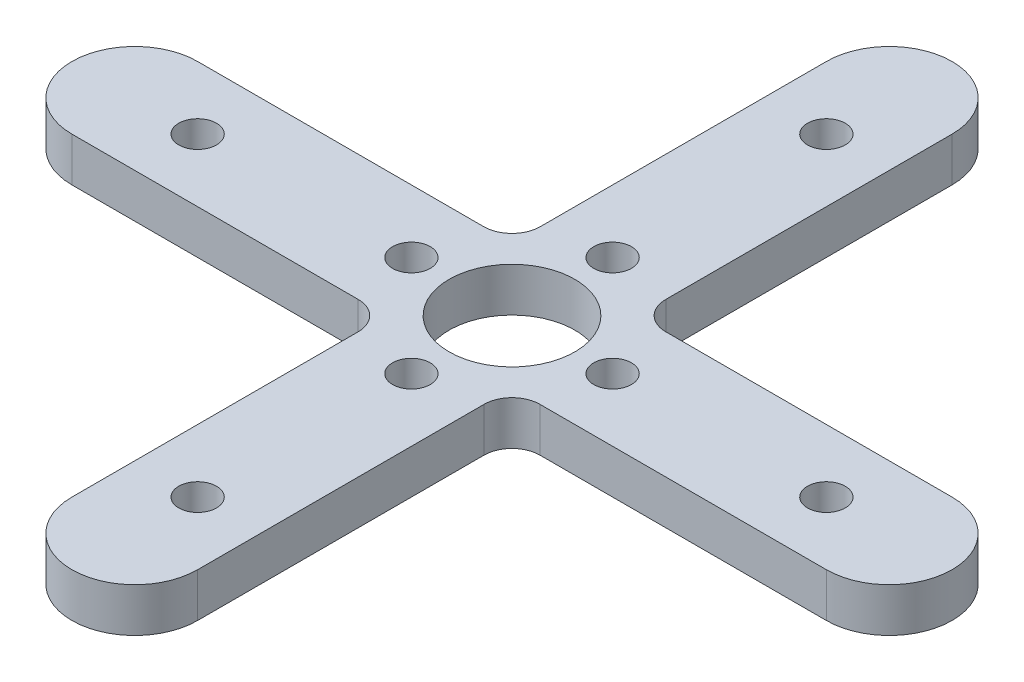
ISO-10303-21;
HEADER;
FILE_DESCRIPTION(('STEP AP214'),'2;1');
FILE_NAME('part.step','',(''),(''),'','','');
FILE_SCHEMA(('AUTOMOTIVE_DESIGN { 1 0 10303 214 1 1 1 1 }'));
ENDSEC;
DATA;
#1=APPLICATION_CONTEXT('core data for automotive mechanical design processes');
#2=APPLICATION_PROTOCOL_DEFINITION('international standard','automotive_design',2000,#1);
#3=PRODUCT_CONTEXT('',#1,'mechanical');
#4=PRODUCT('Part','Part','',(#3));
#5=PRODUCT_RELATED_PRODUCT_CATEGORY('part','',(#4));
#6=PRODUCT_DEFINITION_FORMATION('','',#4);
#7=PRODUCT_DEFINITION_CONTEXT('part definition',#1,'design');
#8=PRODUCT_DEFINITION('design','',#6,#7);
#9=PRODUCT_DEFINITION_SHAPE('','',#8);
#10=(LENGTH_UNIT() NAMED_UNIT(*) SI_UNIT(.MILLI.,.METRE.));
#11=(NAMED_UNIT(*) PLANE_ANGLE_UNIT() SI_UNIT($,.RADIAN.));
#12=(NAMED_UNIT(*) SI_UNIT($,.STERADIAN.) SOLID_ANGLE_UNIT());
#13=UNCERTAINTY_MEASURE_WITH_UNIT(LENGTH_MEASURE(1.E-05),#10,'distance_accuracy_value','');
#14=(GEOMETRIC_REPRESENTATION_CONTEXT(3) GLOBAL_UNCERTAINTY_ASSIGNED_CONTEXT((#13)) GLOBAL_UNIT_ASSIGNED_CONTEXT((#10,
#11,#12)) REPRESENTATION_CONTEXT('',''));
#15=CARTESIAN_POINT('',(0.,0.,0.));
#16=DIRECTION('',(0.,0.,1.));
#17=DIRECTION('',(1.,0.,0.));
#18=AXIS2_PLACEMENT_3D('',#15,#16,#17);
#19=CARTESIAN_POINT('',(1.47572531971469,3.5,0.));
#20=DIRECTION('',(1.,0.,0.));
#21=DIRECTION('',(0.,0.,-1.));
#22=AXIS2_PLACEMENT_3D('',#19,#20,#21);
#23=PLANE('',#22);
#24=DIRECTION('',(0.,0.,1.));
#25=VECTOR('',#24,1.);
#26=CARTESIAN_POINT('',(1.47572531971469,0.,0.));
#27=LINE('',#26,#25);
#28=CARTESIAN_POINT('',(1.47572531971468,0.,10.7886740611654));
#29=VERTEX_POINT('',#28);
#30=CARTESIAN_POINT('',(1.47572531971468,0.,33.5464556338722));
#31=VERTEX_POINT('',#30);
#32=EDGE_CURVE('E227',#29,#31,#27,.T.);
#33=ORIENTED_EDGE('',*,*,#32,.T.);
#34=DIRECTION('',(0.,-1.,0.));
#35=VECTOR('',#34,1.);
#36=CARTESIAN_POINT('',(1.47572531971468,3.5,33.5464556338722));
#37=LINE('',#36,#35);
#38=CARTESIAN_POINT('',(1.47572531971468,3.5,33.5464556338722));
#39=VERTEX_POINT('',#38);
#40=EDGE_CURVE('E11',#39,#31,#37,.T.);
#41=ORIENTED_EDGE('',*,*,#40,.F.);
#42=DIRECTION('',(0.,0.,1.));
#43=VECTOR('',#42,1.);
#44=CARTESIAN_POINT('',(1.47572531971469,3.5,0.));
#45=LINE('',#44,#43);
#46=CARTESIAN_POINT('',(1.47572531971468,3.5,10.7886740611654));
#47=VERTEX_POINT('',#46);
#48=EDGE_CURVE('E382',#47,#39,#45,.T.);
#49=ORIENTED_EDGE('',*,*,#48,.F.);
#50=DIRECTION('',(0.,-1.,0.));
#51=VECTOR('',#50,1.);
#52=CARTESIAN_POINT('',(1.47572531971468,3.5,10.7886740611654));
#53=LINE('',#52,#51);
#54=EDGE_CURVE('E187',#47,#29,#53,.T.);
#55=ORIENTED_EDGE('',*,*,#54,.T.);
#56=EDGE_LOOP('',(#33,#41,#49,#55));
#57=FACE_BOUND('',#56,.T.);
#58=ADVANCED_FACE('F41',(#57),#23,.F.);
#59=CARTESIAN_POINT('',(6.47572531971468,3.5,33.5464556338722));
#60=DIRECTION('',(0.,-1.,0.));
#61=DIRECTION('',(0.,0.,-1.));
#62=AXIS2_PLACEMENT_3D('',#59,#60,#61);
#63=CYLINDRICAL_SURFACE('',#62,5.);
#64=CARTESIAN_POINT('',(6.47572531971468,0.,33.5464556338722));
#65=DIRECTION('',(0.,1.,0.));
#66=DIRECTION('',(0.,0.,1.));
#67=AXIS2_PLACEMENT_3D('',#64,#65,#66);
#68=CIRCLE('',#67,5.);
#69=CARTESIAN_POINT('',(11.4757253197147,0.,33.5464556338722));
#70=VERTEX_POINT('',#69);
#71=EDGE_CURVE('E231',#31,#70,#68,.T.);
#72=ORIENTED_EDGE('',*,*,#71,.T.);
#73=DIRECTION('',(0.,-1.,0.));
#74=VECTOR('',#73,1.);
#75=CARTESIAN_POINT('',(11.4757253197147,3.5,33.5464556338722));
#76=LINE('',#75,#74);
#77=CARTESIAN_POINT('',(11.4757253197147,3.5,33.5464556338722));
#78=VERTEX_POINT('',#77);
#79=EDGE_CURVE('E51',#78,#70,#76,.T.);
#80=ORIENTED_EDGE('',*,*,#79,.F.);
#81=CARTESIAN_POINT('',(6.47572531971468,3.5,33.5464556338722));
#82=DIRECTION('',(0.,1.,0.));
#83=DIRECTION('',(0.,0.,1.));
#84=AXIS2_PLACEMENT_3D('',#81,#82,#83);
#85=CIRCLE('',#84,5.);
#86=EDGE_CURVE('E126',#39,#78,#85,.T.);
#87=ORIENTED_EDGE('',*,*,#86,.F.);
#88=ORIENTED_EDGE('',*,*,#40,.T.);
#89=EDGE_LOOP('',(#72,#80,#87,#88));
#90=FACE_BOUND('',#89,.T.);
#91=ADVANCED_FACE('F397',(#90),#63,.T.);
#92=CARTESIAN_POINT('',(11.4757253197147,3.5,0.));
#93=DIRECTION('',(-1.,0.,0.));
#94=DIRECTION('',(0.,0.,1.));
#95=AXIS2_PLACEMENT_3D('',#92,#93,#94);
#96=PLANE('',#95);
#97=DIRECTION('',(0.,0.,-1.));
#98=VECTOR('',#97,1.);
#99=CARTESIAN_POINT('',(11.4757253197147,0.,0.));
#100=LINE('',#99,#98);
#101=CARTESIAN_POINT('',(11.4757253197147,0.,10.7886740611654));
#102=VERTEX_POINT('',#101);
#103=EDGE_CURVE('E234',#70,#102,#100,.T.);
#104=ORIENTED_EDGE('',*,*,#103,.T.);
#105=DIRECTION('',(0.,-1.,0.));
#106=VECTOR('',#105,1.);
#107=CARTESIAN_POINT('',(11.4757253197147,3.5,10.7886740611654));
#108=LINE('',#107,#106);
#109=CARTESIAN_POINT('',(11.4757253197147,3.5,10.7886740611654));
#110=VERTEX_POINT('',#109);
#111=EDGE_CURVE('E318',#110,#102,#108,.T.);
#112=ORIENTED_EDGE('',*,*,#111,.F.);
#113=DIRECTION('',(0.,0.,-1.));
#114=VECTOR('',#113,1.);
#115=CARTESIAN_POINT('',(11.4757253197147,3.5,0.));
#116=LINE('',#115,#114);
#117=EDGE_CURVE('E327',#78,#110,#116,.T.);
#118=ORIENTED_EDGE('',*,*,#117,.F.);
#119=ORIENTED_EDGE('',*,*,#79,.T.);
#120=EDGE_LOOP('',(#104,#112,#118,#119));
#121=FACE_BOUND('',#120,.T.);
#122=ADVANCED_FACE('F325',(#121),#96,.F.);
#123=CARTESIAN_POINT('',(13.6976972523665,3.5,10.7685189761164));
#124=DIRECTION('',(0.,-1.,0.));
#125=DIRECTION('',(0.,0.,-1.));
#126=AXIS2_PLACEMENT_3D('',#123,#124,#125);
#127=CYLINDRICAL_SURFACE('',#126,2.22206334224426);
#128=CARTESIAN_POINT('',(13.6976972523665,0.,10.7685189761164));
#129=DIRECTION('',(0.,1.,0.));
#130=DIRECTION('',(0.,0.,1.));
#131=AXIS2_PLACEMENT_3D('',#128,#129,#130);
#132=CIRCLE('',#131,2.22206334224426);
#133=CARTESIAN_POINT('',(13.6976972523665,0.,8.54645563387217));
#134=VERTEX_POINT('',#133);
#135=EDGE_CURVE('E238',#134,#102,#132,.T.);
#136=ORIENTED_EDGE('',*,*,#135,.F.);
#137=DIRECTION('',(0.,-1.,0.));
#138=VECTOR('',#137,1.);
#139=CARTESIAN_POINT('',(13.6976972523665,3.5,8.54645563387217));
#140=LINE('',#139,#138);
#141=CARTESIAN_POINT('',(13.6976972523665,3.5,8.54645563387217));
#142=VERTEX_POINT('',#141);
#143=EDGE_CURVE('E315',#142,#134,#140,.T.);
#144=ORIENTED_EDGE('',*,*,#143,.F.);
#145=CARTESIAN_POINT('',(13.6976972523665,3.5,10.7685189761164));
#146=DIRECTION('',(0.,1.,0.));
#147=DIRECTION('',(0.,0.,1.));
#148=AXIS2_PLACEMENT_3D('',#145,#146,#147);
#149=CIRCLE('',#148,2.22206334224426);
#150=EDGE_CURVE('E339',#142,#110,#149,.T.);
#151=ORIENTED_EDGE('',*,*,#150,.T.);
#152=ORIENTED_EDGE('',*,*,#111,.T.);
#153=EDGE_LOOP('',(#136,#144,#151,#152));
#154=FACE_BOUND('',#153,.T.);
#155=ADVANCED_FACE('F335',(#154),#127,.F.);
#156=CARTESIAN_POINT('',(0.,3.5,8.54645563387217));
#157=DIRECTION('',(0.,0.,-1.));
#158=DIRECTION('',(-1.,0.,0.));
#159=AXIS2_PLACEMENT_3D('',#156,#157,#158);
#160=PLANE('',#159);
#161=DIRECTION('',(1.,0.,0.));
#162=VECTOR('',#161,1.);
#163=CARTESIAN_POINT('',(0.,0.,8.54645563387217));
#164=LINE('',#163,#162);
#165=CARTESIAN_POINT('',(36.4757253197147,0.,8.54645563387217));
#166=VERTEX_POINT('',#165);
#167=EDGE_CURVE('E242',#134,#166,#164,.T.);
#168=ORIENTED_EDGE('',*,*,#167,.T.);
#169=DIRECTION('',(0.,-1.,0.));
#170=VECTOR('',#169,1.);
#171=CARTESIAN_POINT('',(36.4757253197147,3.5,8.54645563387217));
#172=LINE('',#171,#170);
#173=CARTESIAN_POINT('',(36.4757253197147,3.5,8.54645563387217));
#174=VERTEX_POINT('',#173);
#175=EDGE_CURVE('E311',#174,#166,#172,.T.);
#176=ORIENTED_EDGE('',*,*,#175,.F.);
#177=DIRECTION('',(1.,0.,0.));
#178=VECTOR('',#177,1.);
#179=CARTESIAN_POINT('',(0.,3.5,8.54645563387217));
#180=LINE('',#179,#178);
#181=EDGE_CURVE('E341',#142,#174,#180,.T.);
#182=ORIENTED_EDGE('',*,*,#181,.F.);
#183=ORIENTED_EDGE('',*,*,#143,.T.);
#184=EDGE_LOOP('',(#168,#176,#182,#183));
#185=FACE_BOUND('',#184,.T.);
#186=ADVANCED_FACE('F623',(#185),#160,.F.);
#187=CARTESIAN_POINT('',(36.4757253197147,3.5,3.54645563387217));
#188=DIRECTION('',(0.,-1.,0.));
#189=DIRECTION('',(0.,0.,-1.));
#190=AXIS2_PLACEMENT_3D('',#187,#188,#189);
#191=CYLINDRICAL_SURFACE('',#190,5.);
#192=CARTESIAN_POINT('',(36.4757253197147,0.,3.54645563387217));
#193=DIRECTION('',(0.,1.,0.));
#194=DIRECTION('',(0.,0.,1.));
#195=AXIS2_PLACEMENT_3D('',#192,#193,#194);
#196=CIRCLE('',#195,5.);
#197=CARTESIAN_POINT('',(36.4757253197147,0.,-1.45354436612783));
#198=VERTEX_POINT('',#197);
#199=EDGE_CURVE('E245',#166,#198,#196,.T.);
#200=ORIENTED_EDGE('',*,*,#199,.T.);
#201=DIRECTION('',(0.,-1.,0.));
#202=VECTOR('',#201,1.);
#203=CARTESIAN_POINT('',(36.4757253197147,3.5,-1.45354436612783));
#204=LINE('',#203,#202);
#205=CARTESIAN_POINT('',(36.4757253197147,3.5,-1.45354436612783));
#206=VERTEX_POINT('',#205);
#207=EDGE_CURVE('E308',#206,#198,#204,.T.);
#208=ORIENTED_EDGE('',*,*,#207,.F.);
#209=CARTESIAN_POINT('',(36.4757253197147,3.5,3.54645563387217));
#210=DIRECTION('',(0.,1.,0.));
#211=DIRECTION('',(0.,0.,1.));
#212=AXIS2_PLACEMENT_3D('',#209,#210,#211);
#213=CIRCLE('',#212,5.);
#214=EDGE_CURVE('E345',#174,#206,#213,.T.);
#215=ORIENTED_EDGE('',*,*,#214,.F.);
#216=ORIENTED_EDGE('',*,*,#175,.T.);
#217=EDGE_LOOP('',(#200,#208,#215,#216));
#218=FACE_BOUND('',#217,.T.);
#219=ADVANCED_FACE('F613',(#218),#191,.T.);
#220=CARTESIAN_POINT('',(0.,3.5,-1.45354436612783));
#221=DIRECTION('',(0.,0.,-1.));
#222=DIRECTION('',(-1.,0.,0.));
#223=AXIS2_PLACEMENT_3D('',#220,#221,#222);
#224=PLANE('',#223);
#225=DIRECTION('',(1.,0.,0.));
#226=VECTOR('',#225,1.);
#227=CARTESIAN_POINT('',(0.,0.,-1.45354436612783));
#228=LINE('',#227,#226);
#229=CARTESIAN_POINT('',(13.6976972523665,0.,-1.45354436612783));
#230=VERTEX_POINT('',#229);
#231=EDGE_CURVE('E249',#230,#198,#228,.T.);
#232=ORIENTED_EDGE('',*,*,#231,.F.);
#233=DIRECTION('',(0.,-1.,0.));
#234=VECTOR('',#233,1.);
#235=CARTESIAN_POINT('',(13.6976972523665,3.5,-1.45354436612783));
#236=LINE('',#235,#234);
#237=CARTESIAN_POINT('',(13.6976972523665,3.5,-1.45354436612783));
#238=VERTEX_POINT('',#237);
#239=EDGE_CURVE('E305',#238,#230,#236,.T.);
#240=ORIENTED_EDGE('',*,*,#239,.F.);
#241=DIRECTION('',(1.,0.,0.));
#242=VECTOR('',#241,1.);
#243=CARTESIAN_POINT('',(0.,3.5,-1.45354436612783));
#244=LINE('',#243,#242);
#245=EDGE_CURVE('E352',#238,#206,#244,.T.);
#246=ORIENTED_EDGE('',*,*,#245,.T.);
#247=ORIENTED_EDGE('',*,*,#207,.T.);
#248=EDGE_LOOP('',(#232,#240,#246,#247));
#249=FACE_BOUND('',#248,.T.);
#250=ADVANCED_FACE('F603',(#249),#224,.T.);
#251=CARTESIAN_POINT('',(13.6976972523665,3.5,-3.67560770837209));
#252=DIRECTION('',(0.,-1.,0.));
#253=DIRECTION('',(0.,0.,-1.));
#254=AXIS2_PLACEMENT_3D('',#251,#252,#253);
#255=CYLINDRICAL_SURFACE('',#254,2.22206334224426);
#256=CARTESIAN_POINT('',(13.6976972523665,0.,-3.67560770837209));
#257=DIRECTION('',(0.,1.,0.));
#258=DIRECTION('',(0.,0.,1.));
#259=AXIS2_PLACEMENT_3D('',#256,#257,#258);
#260=CIRCLE('',#259,2.22206334224426);
#261=CARTESIAN_POINT('',(11.4757253197147,0.,-3.6957627934212));
#262=VERTEX_POINT('',#261);
#263=EDGE_CURVE('E253',#262,#230,#260,.T.);
#264=ORIENTED_EDGE('',*,*,#263,.F.);
#265=DIRECTION('',(0.,-1.,0.));
#266=VECTOR('',#265,1.);
#267=CARTESIAN_POINT('',(11.4757253197147,3.5,-3.6957627934212));
#268=LINE('',#267,#266);
#269=CARTESIAN_POINT('',(11.4757253197147,3.5,-3.6957627934212));
#270=VERTEX_POINT('',#269);
#271=EDGE_CURVE('E302',#270,#262,#268,.T.);
#272=ORIENTED_EDGE('',*,*,#271,.F.);
#273=CARTESIAN_POINT('',(13.6976972523665,3.5,-3.67560770837209));
#274=DIRECTION('',(0.,1.,0.));
#275=DIRECTION('',(0.,0.,1.));
#276=AXIS2_PLACEMENT_3D('',#273,#274,#275);
#277=CIRCLE('',#276,2.22206334224426);
#278=EDGE_CURVE('E356',#270,#238,#277,.T.);
#279=ORIENTED_EDGE('',*,*,#278,.T.);
#280=ORIENTED_EDGE('',*,*,#239,.T.);
#281=EDGE_LOOP('',(#264,#272,#279,#280));
#282=FACE_BOUND('',#281,.T.);
#283=ADVANCED_FACE('F593',(#282),#255,.F.);
#284=CARTESIAN_POINT('',(11.4757253197147,3.5,0.));
#285=DIRECTION('',(1.,0.,0.));
#286=DIRECTION('',(0.,0.,-1.));
#287=AXIS2_PLACEMENT_3D('',#284,#285,#286);
#288=PLANE('',#287);
#289=DIRECTION('',(0.,0.,1.));
#290=VECTOR('',#289,1.);
#291=CARTESIAN_POINT('',(11.4757253197147,0.,0.));
#292=LINE('',#291,#290);
#293=CARTESIAN_POINT('',(11.4757253197147,0.,-26.4535443661278));
#294=VERTEX_POINT('',#293);
#295=EDGE_CURVE('E257',#294,#262,#292,.T.);
#296=ORIENTED_EDGE('',*,*,#295,.F.);
#297=DIRECTION('',(0.,-1.,0.));
#298=VECTOR('',#297,1.);
#299=CARTESIAN_POINT('',(11.4757253197147,3.5,-26.4535443661278));
#300=LINE('',#299,#298);
#301=CARTESIAN_POINT('',(11.4757253197147,3.5,-26.4535443661278));
#302=VERTEX_POINT('',#301);
#303=EDGE_CURVE('E299',#302,#294,#300,.T.);
#304=ORIENTED_EDGE('',*,*,#303,.F.);
#305=DIRECTION('',(0.,0.,1.));
#306=VECTOR('',#305,1.);
#307=CARTESIAN_POINT('',(11.4757253197147,3.5,0.));
#308=LINE('',#307,#306);
#309=EDGE_CURVE('E360',#302,#270,#308,.T.);
#310=ORIENTED_EDGE('',*,*,#309,.T.);
#311=ORIENTED_EDGE('',*,*,#271,.T.);
#312=EDGE_LOOP('',(#296,#304,#310,#311));
#313=FACE_BOUND('',#312,.T.);
#314=ADVANCED_FACE('F583',(#313),#288,.T.);
#315=CARTESIAN_POINT('',(6.47572531971468,3.5,-26.4535443661278));
#316=DIRECTION('',(0.,-1.,0.));
#317=DIRECTION('',(0.,0.,-1.));
#318=AXIS2_PLACEMENT_3D('',#315,#316,#317);
#319=CYLINDRICAL_SURFACE('',#318,5.);
#320=CARTESIAN_POINT('',(6.47572531971468,0.,-26.4535443661278));
#321=DIRECTION('',(0.,1.,0.));
#322=DIRECTION('',(0.,0.,1.));
#323=AXIS2_PLACEMENT_3D('',#320,#321,#322);
#324=CIRCLE('',#323,5.);
#325=CARTESIAN_POINT('',(1.47572531971468,0.,-26.4535443661278));
#326=VERTEX_POINT('',#325);
#327=EDGE_CURVE('E261',#294,#326,#324,.T.);
#328=ORIENTED_EDGE('',*,*,#327,.T.);
#329=DIRECTION('',(0.,-1.,0.));
#330=VECTOR('',#329,1.);
#331=CARTESIAN_POINT('',(1.47572531971468,3.5,-26.4535443661278));
#332=LINE('',#331,#330);
#333=CARTESIAN_POINT('',(1.47572531971468,3.5,-26.4535443661278));
#334=VERTEX_POINT('',#333);
#335=EDGE_CURVE('E296',#334,#326,#332,.T.);
#336=ORIENTED_EDGE('',*,*,#335,.F.);
#337=CARTESIAN_POINT('',(6.47572531971468,3.5,-26.4535443661278));
#338=DIRECTION('',(0.,1.,0.));
#339=DIRECTION('',(0.,0.,1.));
#340=AXIS2_PLACEMENT_3D('',#337,#338,#339);
#341=CIRCLE('',#340,5.);
#342=EDGE_CURVE('E364',#302,#334,#341,.T.);
#343=ORIENTED_EDGE('',*,*,#342,.F.);
#344=ORIENTED_EDGE('',*,*,#303,.T.);
#345=EDGE_LOOP('',(#328,#336,#343,#344));
#346=FACE_BOUND('',#345,.T.);
#347=ADVANCED_FACE('F572',(#346),#319,.T.);
#348=CARTESIAN_POINT('',(1.47572531971468,3.5,0.));
#349=DIRECTION('',(-1.,0.,0.));
#350=DIRECTION('',(0.,0.,1.));
#351=AXIS2_PLACEMENT_3D('',#348,#349,#350);
#352=PLANE('',#351);
#353=DIRECTION('',(0.,0.,-1.));
#354=VECTOR('',#353,1.);
#355=CARTESIAN_POINT('',(1.47572531971468,0.,0.));
#356=LINE('',#355,#354);
#357=CARTESIAN_POINT('',(1.47572531971468,0.,-3.69576279342108));
#358=VERTEX_POINT('',#357);
#359=EDGE_CURVE('E265',#358,#326,#356,.T.);
#360=ORIENTED_EDGE('',*,*,#359,.F.);
#361=DIRECTION('',(0.,-1.,0.));
#362=VECTOR('',#361,1.);
#363=CARTESIAN_POINT('',(1.47572531971468,3.5,-3.69576279342108));
#364=LINE('',#363,#362);
#365=CARTESIAN_POINT('',(1.47572531971468,3.5,-3.69576279342108));
#366=VERTEX_POINT('',#365);
#367=EDGE_CURVE('E293',#366,#358,#364,.T.);
#368=ORIENTED_EDGE('',*,*,#367,.F.);
#369=DIRECTION('',(0.,0.,-1.));
#370=VECTOR('',#369,1.);
#371=CARTESIAN_POINT('',(1.47572531971468,3.5,0.));
#372=LINE('',#371,#370);
#373=EDGE_CURVE('E367',#366,#334,#372,.T.);
#374=ORIENTED_EDGE('',*,*,#373,.T.);
#375=ORIENTED_EDGE('',*,*,#335,.T.);
#376=EDGE_LOOP('',(#360,#368,#374,#375));
#377=FACE_BOUND('',#376,.T.);
#378=ADVANCED_FACE('F562',(#377),#352,.T.);
#379=CARTESIAN_POINT('',(-0.766493107578561,3.5,-3.69576279342108));
#380=DIRECTION('',(0.,-1.,0.));
#381=DIRECTION('',(0.,0.,-1.));
#382=AXIS2_PLACEMENT_3D('',#379,#380,#381);
#383=CYLINDRICAL_SURFACE('',#382,2.24221842729325);
#384=CARTESIAN_POINT('',(-0.766493107578561,0.,-3.69576279342108));
#385=DIRECTION('',(0.,1.,0.));
#386=DIRECTION('',(0.,0.,1.));
#387=AXIS2_PLACEMENT_3D('',#384,#385,#386);
#388=CIRCLE('',#387,2.24221842729325);
#389=CARTESIAN_POINT('',(-0.766493107578561,0.,-1.45354436612783));
#390=VERTEX_POINT('',#389);
#391=EDGE_CURVE('E269',#390,#358,#388,.T.);
#392=ORIENTED_EDGE('',*,*,#391,.F.);
#393=DIRECTION('',(0.,-1.,0.));
#394=VECTOR('',#393,1.);
#395=CARTESIAN_POINT('',(-0.766493107578561,3.5,-1.45354436612783));
#396=LINE('',#395,#394);
#397=CARTESIAN_POINT('',(-0.766493107578561,3.5,-1.45354436612783));
#398=VERTEX_POINT('',#397);
#399=EDGE_CURVE('E290',#398,#390,#396,.T.);
#400=ORIENTED_EDGE('',*,*,#399,.F.);
#401=CARTESIAN_POINT('',(-0.766493107578561,3.5,-3.69576279342108));
#402=DIRECTION('',(0.,1.,0.));
#403=DIRECTION('',(0.,0.,1.));
#404=AXIS2_PLACEMENT_3D('',#401,#402,#403);
#405=CIRCLE('',#404,2.24221842729325);
#406=EDGE_CURVE('E371',#398,#366,#405,.T.);
#407=ORIENTED_EDGE('',*,*,#406,.T.);
#408=ORIENTED_EDGE('',*,*,#367,.T.);
#409=EDGE_LOOP('',(#392,#400,#407,#408));
#410=FACE_BOUND('',#409,.T.);
#411=ADVANCED_FACE('F553',(#410),#383,.F.);
#412=CARTESIAN_POINT('',(0.,3.5,-1.45354436612783));
#413=DIRECTION('',(0.,0.,-1.));
#414=DIRECTION('',(-1.,0.,0.));
#415=AXIS2_PLACEMENT_3D('',#412,#413,#414);
#416=PLANE('',#415);
#417=DIRECTION('',(1.,0.,0.));
#418=VECTOR('',#417,1.);
#419=CARTESIAN_POINT('',(0.,0.,-1.45354436612783));
#420=LINE('',#419,#418);
#421=CARTESIAN_POINT('',(-23.5242746802853,0.,-1.45354436612783));
#422=VERTEX_POINT('',#421);
#423=EDGE_CURVE('E273',#422,#390,#420,.T.);
#424=ORIENTED_EDGE('',*,*,#423,.F.);
#425=DIRECTION('',(0.,-1.,0.));
#426=VECTOR('',#425,1.);
#427=CARTESIAN_POINT('',(-23.5242746802853,3.5,-1.45354436612783));
#428=LINE('',#427,#426);
#429=CARTESIAN_POINT('',(-23.5242746802853,3.5,-1.45354436612783));
#430=VERTEX_POINT('',#429);
#431=EDGE_CURVE('E180',#430,#422,#428,.T.);
#432=ORIENTED_EDGE('',*,*,#431,.F.);
#433=DIRECTION('',(1.,0.,0.));
#434=VECTOR('',#433,1.);
#435=CARTESIAN_POINT('',(0.,3.5,-1.45354436612783));
#436=LINE('',#435,#434);
#437=EDGE_CURVE('E171',#430,#398,#436,.T.);
#438=ORIENTED_EDGE('',*,*,#437,.T.);
#439=ORIENTED_EDGE('',*,*,#399,.T.);
#440=EDGE_LOOP('',(#424,#432,#438,#439));
#441=FACE_BOUND('',#440,.T.);
#442=ADVANCED_FACE('F377',(#441),#416,.T.);
#443=CARTESIAN_POINT('',(-23.5242746802853,3.5,3.54645563387217));
#444=DIRECTION('',(0.,-1.,0.));
#445=DIRECTION('',(0.,0.,-1.));
#446=AXIS2_PLACEMENT_3D('',#443,#444,#445);
#447=CYLINDRICAL_SURFACE('',#446,5.);
#448=CARTESIAN_POINT('',(-23.5242746802853,0.,3.54645563387217));
#449=DIRECTION('',(0.,1.,0.));
#450=DIRECTION('',(0.,0.,1.));
#451=AXIS2_PLACEMENT_3D('',#448,#449,#450);
#452=CIRCLE('',#451,5.);
#453=CARTESIAN_POINT('',(-23.5242746802853,0.,8.54645563387217));
#454=VERTEX_POINT('',#453);
#455=EDGE_CURVE('E178',#422,#454,#452,.T.);
#456=ORIENTED_EDGE('',*,*,#455,.T.);
#457=DIRECTION('',(0.,-1.,0.));
#458=VECTOR('',#457,1.);
#459=CARTESIAN_POINT('',(-23.5242746802853,3.5,8.54645563387217));
#460=LINE('',#459,#458);
#461=CARTESIAN_POINT('',(-23.5242746802853,3.5,8.54645563387217));
#462=VERTEX_POINT('',#461);
#463=EDGE_CURVE('E175',#462,#454,#460,.T.);
#464=ORIENTED_EDGE('',*,*,#463,.F.);
#465=CARTESIAN_POINT('',(-23.5242746802853,3.5,3.54645563387217));
#466=DIRECTION('',(0.,1.,0.));
#467=DIRECTION('',(0.,0.,1.));
#468=AXIS2_PLACEMENT_3D('',#465,#466,#467);
#469=CIRCLE('',#468,5.);
#470=EDGE_CURVE('E164',#430,#462,#469,.T.);
#471=ORIENTED_EDGE('',*,*,#470,.F.);
#472=ORIENTED_EDGE('',*,*,#431,.T.);
#473=EDGE_LOOP('',(#456,#464,#471,#472));
#474=FACE_BOUND('',#473,.T.);
#475=ADVANCED_FACE('F176',(#474),#447,.T.);
#476=CARTESIAN_POINT('',(0.,3.5,8.54645563387217));
#477=DIRECTION('',(0.,0.,-1.));
#478=DIRECTION('',(-1.,0.,0.));
#479=AXIS2_PLACEMENT_3D('',#476,#477,#478);
#480=PLANE('',#479);
#481=DIRECTION('',(1.,0.,0.));
#482=VECTOR('',#481,1.);
#483=CARTESIAN_POINT('',(0.,0.,8.54645563387217));
#484=LINE('',#483,#482);
#485=CARTESIAN_POINT('',(-0.766493107578561,0.,8.54645563387217));
#486=VERTEX_POINT('',#485);
#487=EDGE_CURVE('E112',#454,#486,#484,.T.);
#488=ORIENTED_EDGE('',*,*,#487,.T.);
#489=DIRECTION('',(0.,-1.,0.));
#490=VECTOR('',#489,1.);
#491=CARTESIAN_POINT('',(-0.766493107578561,3.5,8.54645563387217));
#492=LINE('',#491,#490);
#493=CARTESIAN_POINT('',(-0.766493107578561,3.5,8.54645563387217));
#494=VERTEX_POINT('',#493);
#495=EDGE_CURVE('E181',#494,#486,#492,.T.);
#496=ORIENTED_EDGE('',*,*,#495,.F.);
#497=DIRECTION('',(1.,0.,0.));
#498=VECTOR('',#497,1.);
#499=CARTESIAN_POINT('',(0.,3.5,8.54645563387217));
#500=LINE('',#499,#498);
#501=EDGE_CURVE('E168',#462,#494,#500,.T.);
#502=ORIENTED_EDGE('',*,*,#501,.F.);
#503=ORIENTED_EDGE('',*,*,#463,.T.);
#504=EDGE_LOOP('',(#488,#496,#502,#503));
#505=FACE_BOUND('',#504,.T.);
#506=ADVANCED_FACE('F183',(#505),#480,.F.);
#507=CARTESIAN_POINT('',(6.47572531971469,3.5,3.54645563387217));
#508=DIRECTION('',(0.,-1.,0.));
#509=DIRECTION('',(0.,0.,-1.));
#510=AXIS2_PLACEMENT_3D('',#507,#508,#509);
#511=CYLINDRICAL_SURFACE('',#510,5.);
#512=CARTESIAN_POINT('',(6.47572531971469,3.5,3.54645563387217));
#513=DIRECTION('',(0.,1.,0.));
#514=DIRECTION('',(0.,0.,1.));
#515=AXIS2_PLACEMENT_3D('',#512,#513,#514);
#516=CIRCLE('',#515,5.);
#517=CARTESIAN_POINT('',(6.47572531971469,3.5,8.54645563387217));
#518=VERTEX_POINT('',#517);
#519=EDGE_CURVE('E717',#518,#518,#516,.T.);
#520=ORIENTED_EDGE('',*,*,#519,.T.);
#521=EDGE_LOOP('',(#520));
#522=FACE_BOUND('',#521,.T.);
#523=CARTESIAN_POINT('',(6.47572531971469,0.,3.54645563387217));
#524=DIRECTION('',(0.,1.,0.));
#525=DIRECTION('',(0.,0.,1.));
#526=AXIS2_PLACEMENT_3D('',#523,#524,#525);
#527=CIRCLE('',#526,5.);
#528=CARTESIAN_POINT('',(6.47572531971469,0.,8.54645563387217));
#529=VERTEX_POINT('',#528);
#530=EDGE_CURVE('E223',#529,#529,#527,.T.);
#531=ORIENTED_EDGE('',*,*,#530,.F.);
#532=EDGE_LOOP('',(#531));
#533=FACE_BOUND('',#532,.T.);
#534=ADVANCED_FACE('F405',(#522,#533),#511,.F.);
#535=CARTESIAN_POINT('',(-1.52427468028531,3.5,3.54645563387217));
#536=DIRECTION('',(0.,-1.,0.));
#537=DIRECTION('',(0.,0.,-1.));
#538=AXIS2_PLACEMENT_3D('',#535,#536,#537);
#539=CYLINDRICAL_SURFACE('',#538,1.5);
#540=CARTESIAN_POINT('',(-1.52427468028531,3.5,3.54645563387217));
#541=DIRECTION('',(0.,1.,0.));
#542=DIRECTION('',(0.,0.,1.));
#543=AXIS2_PLACEMENT_3D('',#540,#541,#542);
#544=CIRCLE('',#543,1.5);
#545=CARTESIAN_POINT('',(-1.52427468028531,3.5,5.04645563387217));
#546=VERTEX_POINT('',#545);
#547=EDGE_CURVE('E713',#546,#546,#544,.T.);
#548=ORIENTED_EDGE('',*,*,#547,.T.);
#549=EDGE_LOOP('',(#548));
#550=FACE_BOUND('',#549,.T.);
#551=CARTESIAN_POINT('',(-1.52427468028531,0.,3.54645563387217));
#552=DIRECTION('',(0.,1.,0.));
#553=DIRECTION('',(0.,0.,1.));
#554=AXIS2_PLACEMENT_3D('',#551,#552,#553);
#555=CIRCLE('',#554,1.5);
#556=CARTESIAN_POINT('',(-1.52427468028531,0.,5.04645563387217));
#557=VERTEX_POINT('',#556);
#558=EDGE_CURVE('E219',#557,#557,#555,.T.);
#559=ORIENTED_EDGE('',*,*,#558,.F.);
#560=EDGE_LOOP('',(#559));
#561=FACE_BOUND('',#560,.T.);
#562=ADVANCED_FACE('F408',(#550,#561),#539,.F.);
#563=CARTESIAN_POINT('',(14.4757253197147,3.5,3.54645563387217));
#564=DIRECTION('',(0.,-1.,0.));
#565=DIRECTION('',(0.,0.,-1.));
#566=AXIS2_PLACEMENT_3D('',#563,#564,#565);
#567=CYLINDRICAL_SURFACE('',#566,1.5);
#568=CARTESIAN_POINT('',(14.4757253197147,3.5,3.54645563387217));
#569=DIRECTION('',(0.,1.,0.));
#570=DIRECTION('',(0.,0.,1.));
#571=AXIS2_PLACEMENT_3D('',#568,#569,#570);
#572=CIRCLE('',#571,1.5);
#573=CARTESIAN_POINT('',(14.4757253197147,3.5,5.04645563387217));
#574=VERTEX_POINT('',#573);
#575=EDGE_CURVE('E709',#574,#574,#572,.T.);
#576=ORIENTED_EDGE('',*,*,#575,.T.);
#577=EDGE_LOOP('',(#576));
#578=FACE_BOUND('',#577,.T.);
#579=CARTESIAN_POINT('',(14.4757253197147,0.,3.54645563387217));
#580=DIRECTION('',(0.,1.,0.));
#581=DIRECTION('',(0.,0.,1.));
#582=AXIS2_PLACEMENT_3D('',#579,#580,#581);
#583=CIRCLE('',#582,1.5);
#584=CARTESIAN_POINT('',(14.4757253197147,0.,5.04645563387217));
#585=VERTEX_POINT('',#584);
#586=EDGE_CURVE('E215',#585,#585,#583,.T.);
#587=ORIENTED_EDGE('',*,*,#586,.F.);
#588=EDGE_LOOP('',(#587));
#589=FACE_BOUND('',#588,.T.);
#590=ADVANCED_FACE('F412',(#578,#589),#567,.F.);
#591=CARTESIAN_POINT('',(-18.5242746802853,3.5,3.54645563387217));
#592=DIRECTION('',(0.,-1.,0.));
#593=DIRECTION('',(0.,0.,-1.));
#594=AXIS2_PLACEMENT_3D('',#591,#592,#593);
#595=CYLINDRICAL_SURFACE('',#594,1.5);
#596=CARTESIAN_POINT('',(-18.5242746802853,3.5,3.54645563387217));
#597=DIRECTION('',(0.,1.,0.));
#598=DIRECTION('',(0.,0.,1.));
#599=AXIS2_PLACEMENT_3D('',#596,#597,#598);
#600=CIRCLE('',#599,1.5);
#601=CARTESIAN_POINT('',(-18.5242746802853,3.5,5.04645563387217));
#602=VERTEX_POINT('',#601);
#603=EDGE_CURVE('E705',#602,#602,#600,.T.);
#604=ORIENTED_EDGE('',*,*,#603,.T.);
#605=EDGE_LOOP('',(#604));
#606=FACE_BOUND('',#605,.T.);
#607=CARTESIAN_POINT('',(-18.5242746802853,0.,3.54645563387217));
#608=DIRECTION('',(0.,1.,0.));
#609=DIRECTION('',(0.,0.,1.));
#610=AXIS2_PLACEMENT_3D('',#607,#608,#609);
#611=CIRCLE('',#610,1.5);
#612=CARTESIAN_POINT('',(-18.5242746802853,0.,5.04645563387217));
#613=VERTEX_POINT('',#612);
#614=EDGE_CURVE('E211',#613,#613,#611,.T.);
#615=ORIENTED_EDGE('',*,*,#614,.F.);
#616=EDGE_LOOP('',(#615));
#617=FACE_BOUND('',#616,.T.);
#618=ADVANCED_FACE('F416',(#606,#617),#595,.F.);
#619=CARTESIAN_POINT('',(6.47572531971469,3.5,-21.4535443661279));
#620=DIRECTION('',(0.,-1.,0.));
#621=DIRECTION('',(0.,0.,-1.));
#622=AXIS2_PLACEMENT_3D('',#619,#620,#621);
#623=CYLINDRICAL_SURFACE('',#622,1.5);
#624=CARTESIAN_POINT('',(6.47572531971469,3.5,-21.4535443661279));
#625=DIRECTION('',(0.,1.,0.));
#626=DIRECTION('',(0.,0.,1.));
#627=AXIS2_PLACEMENT_3D('',#624,#625,#626);
#628=CIRCLE('',#627,1.5);
#629=CARTESIAN_POINT('',(6.47572531971469,3.5,-19.9535443661279));
#630=VERTEX_POINT('',#629);
#631=EDGE_CURVE('E701',#630,#630,#628,.T.);
#632=ORIENTED_EDGE('',*,*,#631,.T.);
#633=EDGE_LOOP('',(#632));
#634=FACE_BOUND('',#633,.T.);
#635=CARTESIAN_POINT('',(6.47572531971469,0.,-21.4535443661279));
#636=DIRECTION('',(0.,1.,0.));
#637=DIRECTION('',(0.,0.,1.));
#638=AXIS2_PLACEMENT_3D('',#635,#636,#637);
#639=CIRCLE('',#638,1.5);
#640=CARTESIAN_POINT('',(6.47572531971469,0.,-19.9535443661279));
#641=VERTEX_POINT('',#640);
#642=EDGE_CURVE('E207',#641,#641,#639,.T.);
#643=ORIENTED_EDGE('',*,*,#642,.F.);
#644=EDGE_LOOP('',(#643));
#645=FACE_BOUND('',#644,.T.);
#646=ADVANCED_FACE('F420',(#634,#645),#623,.F.);
#647=CARTESIAN_POINT('',(31.4757253197147,3.5,3.54645563387213));
#648=DIRECTION('',(0.,-1.,0.));
#649=DIRECTION('',(0.,0.,-1.));
#650=AXIS2_PLACEMENT_3D('',#647,#648,#649);
#651=CYLINDRICAL_SURFACE('',#650,1.5);
#652=CARTESIAN_POINT('',(31.4757253197147,3.5,3.54645563387213));
#653=DIRECTION('',(0.,1.,0.));
#654=DIRECTION('',(0.,0.,1.));
#655=AXIS2_PLACEMENT_3D('',#652,#653,#654);
#656=CIRCLE('',#655,1.5);
#657=CARTESIAN_POINT('',(31.4757253197147,3.5,5.04645563387213));
#658=VERTEX_POINT('',#657);
#659=EDGE_CURVE('E693',#658,#658,#656,.T.);
#660=ORIENTED_EDGE('',*,*,#659,.T.);
#661=EDGE_LOOP('',(#660));
#662=FACE_BOUND('',#661,.T.);
#663=CARTESIAN_POINT('',(31.4757253197147,0.,3.54645563387213));
#664=DIRECTION('',(0.,1.,0.));
#665=DIRECTION('',(0.,0.,1.));
#666=AXIS2_PLACEMENT_3D('',#663,#664,#665);
#667=CIRCLE('',#666,1.5);
#668=CARTESIAN_POINT('',(31.4757253197147,0.,5.04645563387213));
#669=VERTEX_POINT('',#668);
#670=EDGE_CURVE('E203',#669,#669,#667,.T.);
#671=ORIENTED_EDGE('',*,*,#670,.F.);
#672=EDGE_LOOP('',(#671));
#673=FACE_BOUND('',#672,.T.);
#674=ADVANCED_FACE('F424',(#662,#673),#651,.F.);
#675=CARTESIAN_POINT('',(6.47572531971469,3.5,28.5464556338721));
#676=DIRECTION('',(0.,-1.,0.));
#677=DIRECTION('',(0.,0.,-1.));
#678=AXIS2_PLACEMENT_3D('',#675,#676,#677);
#679=CYLINDRICAL_SURFACE('',#678,1.5);
#680=CARTESIAN_POINT('',(6.47572531971469,3.5,28.5464556338721));
#681=DIRECTION('',(0.,1.,0.));
#682=DIRECTION('',(0.,0.,1.));
#683=AXIS2_PLACEMENT_3D('',#680,#681,#682);
#684=CIRCLE('',#683,1.5);
#685=CARTESIAN_POINT('',(6.47572531971469,3.5,30.0464556338721));
#686=VERTEX_POINT('',#685);
#687=EDGE_CURVE('E688',#686,#686,#684,.T.);
#688=ORIENTED_EDGE('',*,*,#687,.T.);
#689=EDGE_LOOP('',(#688));
#690=FACE_BOUND('',#689,.T.);
#691=CARTESIAN_POINT('',(6.47572531971469,0.,28.5464556338721));
#692=DIRECTION('',(0.,1.,0.));
#693=DIRECTION('',(0.,0.,1.));
#694=AXIS2_PLACEMENT_3D('',#691,#692,#693);
#695=CIRCLE('',#694,1.5);
#696=CARTESIAN_POINT('',(6.47572531971469,0.,30.0464556338721));
#697=VERTEX_POINT('',#696);
#698=EDGE_CURVE('E199',#697,#697,#695,.T.);
#699=ORIENTED_EDGE('',*,*,#698,.F.);
#700=EDGE_LOOP('',(#699));
#701=FACE_BOUND('',#700,.T.);
#702=ADVANCED_FACE('F428',(#690,#701),#679,.F.);
#703=CARTESIAN_POINT('',(6.47572531971469,3.5,11.5464556338721));
#704=DIRECTION('',(0.,-1.,0.));
#705=DIRECTION('',(0.,0.,-1.));
#706=AXIS2_PLACEMENT_3D('',#703,#704,#705);
#707=CYLINDRICAL_SURFACE('',#706,1.5);
#708=CARTESIAN_POINT('',(6.47572531971469,3.5,11.5464556338721));
#709=DIRECTION('',(0.,1.,0.));
#710=DIRECTION('',(0.,0.,1.));
#711=AXIS2_PLACEMENT_3D('',#708,#709,#710);
#712=CIRCLE('',#711,1.5);
#713=CARTESIAN_POINT('',(6.47572531971469,3.5,13.0464556338721));
#714=VERTEX_POINT('',#713);
#715=EDGE_CURVE('E439',#714,#714,#712,.T.);
#716=ORIENTED_EDGE('',*,*,#715,.T.);
#717=EDGE_LOOP('',(#716));
#718=FACE_BOUND('',#717,.T.);
#719=CARTESIAN_POINT('',(6.47572531971469,0.,11.5464556338721));
#720=DIRECTION('',(0.,1.,0.));
#721=DIRECTION('',(0.,0.,1.));
#722=AXIS2_PLACEMENT_3D('',#719,#720,#721);
#723=CIRCLE('',#722,1.5);
#724=CARTESIAN_POINT('',(6.47572531971469,0.,13.0464556338721));
#725=VERTEX_POINT('',#724);
#726=EDGE_CURVE('E195',#725,#725,#723,.T.);
#727=ORIENTED_EDGE('',*,*,#726,.F.);
#728=EDGE_LOOP('',(#727));
#729=FACE_BOUND('',#728,.T.);
#730=ADVANCED_FACE('F392',(#718,#729),#707,.F.);
#731=CARTESIAN_POINT('',(6.47572531971469,3.5,-4.45354436612787));
#732=DIRECTION('',(0.,-1.,0.));
#733=DIRECTION('',(0.,0.,-1.));
#734=AXIS2_PLACEMENT_3D('',#731,#732,#733);
#735=CYLINDRICAL_SURFACE('',#734,1.5);
#736=CARTESIAN_POINT('',(6.47572531971469,3.5,-4.45354436612787));
#737=DIRECTION('',(0.,1.,0.));
#738=DIRECTION('',(0.,0.,1.));
#739=AXIS2_PLACEMENT_3D('',#736,#737,#738);
#740=CIRCLE('',#739,1.5);
#741=CARTESIAN_POINT('',(6.47572531971469,3.5,-2.95354436612787));
#742=VERTEX_POINT('',#741);
#743=EDGE_CURVE('E283',#742,#742,#740,.T.);
#744=ORIENTED_EDGE('',*,*,#743,.T.);
#745=EDGE_LOOP('',(#744));
#746=FACE_BOUND('',#745,.T.);
#747=CARTESIAN_POINT('',(6.47572531971469,0.,-4.45354436612787));
#748=DIRECTION('',(0.,1.,0.));
#749=DIRECTION('',(0.,0.,1.));
#750=AXIS2_PLACEMENT_3D('',#747,#748,#749);
#751=CIRCLE('',#750,1.5);
#752=CARTESIAN_POINT('',(6.47572531971469,0.,-2.95354436612787));
#753=VERTEX_POINT('',#752);
#754=EDGE_CURVE('E191',#753,#753,#751,.T.);
#755=ORIENTED_EDGE('',*,*,#754,.F.);
#756=EDGE_LOOP('',(#755));
#757=FACE_BOUND('',#756,.T.);
#758=ADVANCED_FACE('F43',(#746,#757),#735,.F.);
#759=CARTESIAN_POINT('',(-0.766493107578561,3.5,10.7886740611654));
#760=DIRECTION('',(0.,-1.,0.));
#761=DIRECTION('',(0.,0.,-1.));
#762=AXIS2_PLACEMENT_3D('',#759,#760,#761);
#763=CYLINDRICAL_SURFACE('',#762,2.24221842729325);
#764=CARTESIAN_POINT('',(-0.766493107578561,0.,10.7886740611654));
#765=DIRECTION('',(0.,1.,0.));
#766=DIRECTION('',(0.,0.,1.));
#767=AXIS2_PLACEMENT_3D('',#764,#765,#766);
#768=CIRCLE('',#767,2.24221842729325);
#769=EDGE_CURVE('E118',#486,#29,#768,.F.);
#770=ORIENTED_EDGE('',*,*,#769,.T.);
#771=ORIENTED_EDGE('',*,*,#54,.F.);
#772=CARTESIAN_POINT('',(-0.766493107578561,3.5,10.7886740611654));
#773=DIRECTION('',(0.,1.,0.));
#774=DIRECTION('',(0.,0.,1.));
#775=AXIS2_PLACEMENT_3D('',#772,#773,#774);
#776=CIRCLE('',#775,2.24221842729325);
#777=EDGE_CURVE('E59',#494,#47,#776,.F.);
#778=ORIENTED_EDGE('',*,*,#777,.F.);
#779=ORIENTED_EDGE('',*,*,#495,.T.);
#780=EDGE_LOOP('',(#770,#771,#778,#779));
#781=FACE_BOUND('',#780,.T.);
#782=ADVANCED_FACE('F383',(#781),#763,.F.);
#783=CARTESIAN_POINT('',(0.,3.5,0.));
#784=DIRECTION('',(0.,1.,0.));
#785=DIRECTION('',(0.,0.,1.));
#786=AXIS2_PLACEMENT_3D('',#783,#784,#785);
#787=PLANE('',#786);
#788=ORIENTED_EDGE('',*,*,#743,.F.);
#789=EDGE_LOOP('',(#788));
#790=FACE_BOUND('',#789,.T.);
#791=ORIENTED_EDGE('',*,*,#715,.F.);
#792=EDGE_LOOP('',(#791));
#793=FACE_BOUND('',#792,.T.);
#794=ORIENTED_EDGE('',*,*,#687,.F.);
#795=EDGE_LOOP('',(#794));
#796=FACE_BOUND('',#795,.T.);
#797=ORIENTED_EDGE('',*,*,#659,.F.);
#798=EDGE_LOOP('',(#797));
#799=FACE_BOUND('',#798,.T.);
#800=ORIENTED_EDGE('',*,*,#631,.F.);
#801=EDGE_LOOP('',(#800));
#802=FACE_BOUND('',#801,.T.);
#803=ORIENTED_EDGE('',*,*,#603,.F.);
#804=EDGE_LOOP('',(#803));
#805=FACE_BOUND('',#804,.T.);
#806=ORIENTED_EDGE('',*,*,#575,.F.);
#807=EDGE_LOOP('',(#806));
#808=FACE_BOUND('',#807,.T.);
#809=ORIENTED_EDGE('',*,*,#547,.F.);
#810=EDGE_LOOP('',(#809));
#811=FACE_BOUND('',#810,.T.);
#812=ORIENTED_EDGE('',*,*,#519,.F.);
#813=EDGE_LOOP('',(#812));
#814=FACE_BOUND('',#813,.T.);
#815=ORIENTED_EDGE('',*,*,#48,.T.);
#816=ORIENTED_EDGE('',*,*,#86,.T.);
#817=ORIENTED_EDGE('',*,*,#117,.T.);
#818=ORIENTED_EDGE('',*,*,#150,.F.);
#819=ORIENTED_EDGE('',*,*,#181,.T.);
#820=ORIENTED_EDGE('',*,*,#214,.T.);
#821=ORIENTED_EDGE('',*,*,#245,.F.);
#822=ORIENTED_EDGE('',*,*,#278,.F.);
#823=ORIENTED_EDGE('',*,*,#309,.F.);
#824=ORIENTED_EDGE('',*,*,#342,.T.);
#825=ORIENTED_EDGE('',*,*,#373,.F.);
#826=ORIENTED_EDGE('',*,*,#406,.F.);
#827=ORIENTED_EDGE('',*,*,#437,.F.);
#828=ORIENTED_EDGE('',*,*,#470,.T.);
#829=ORIENTED_EDGE('',*,*,#501,.T.);
#830=ORIENTED_EDGE('',*,*,#777,.T.);
#831=EDGE_LOOP('',(#815,#816,#817,#818,#819,#820,#821,#822,#823,#824,#825,#826,#827,#828,#829,#830));
#832=FACE_BOUND('',#831,.T.);
#833=ADVANCED_FACE('F166',(#790,#793,#796,#799,#802,#805,#808,#811,#814,#832),#787,.T.);
#834=CARTESIAN_POINT('',(0.,0.,0.));
#835=DIRECTION('',(0.,1.,0.));
#836=DIRECTION('',(0.,0.,1.));
#837=AXIS2_PLACEMENT_3D('',#834,#835,#836);
#838=PLANE('',#837);
#839=ORIENTED_EDGE('',*,*,#754,.T.);
#840=EDGE_LOOP('',(#839));
#841=FACE_BOUND('',#840,.T.);
#842=ORIENTED_EDGE('',*,*,#726,.T.);
#843=EDGE_LOOP('',(#842));
#844=FACE_BOUND('',#843,.T.);
#845=ORIENTED_EDGE('',*,*,#698,.T.);
#846=EDGE_LOOP('',(#845));
#847=FACE_BOUND('',#846,.T.);
#848=ORIENTED_EDGE('',*,*,#670,.T.);
#849=EDGE_LOOP('',(#848));
#850=FACE_BOUND('',#849,.T.);
#851=ORIENTED_EDGE('',*,*,#642,.T.);
#852=EDGE_LOOP('',(#851));
#853=FACE_BOUND('',#852,.T.);
#854=ORIENTED_EDGE('',*,*,#614,.T.);
#855=EDGE_LOOP('',(#854));
#856=FACE_BOUND('',#855,.T.);
#857=ORIENTED_EDGE('',*,*,#586,.T.);
#858=EDGE_LOOP('',(#857));
#859=FACE_BOUND('',#858,.T.);
#860=ORIENTED_EDGE('',*,*,#558,.T.);
#861=EDGE_LOOP('',(#860));
#862=FACE_BOUND('',#861,.T.);
#863=ORIENTED_EDGE('',*,*,#530,.T.);
#864=EDGE_LOOP('',(#863));
#865=FACE_BOUND('',#864,.T.);
#866=ORIENTED_EDGE('',*,*,#32,.F.);
#867=ORIENTED_EDGE('',*,*,#769,.F.);
#868=ORIENTED_EDGE('',*,*,#487,.F.);
#869=ORIENTED_EDGE('',*,*,#455,.F.);
#870=ORIENTED_EDGE('',*,*,#423,.T.);
#871=ORIENTED_EDGE('',*,*,#391,.T.);
#872=ORIENTED_EDGE('',*,*,#359,.T.);
#873=ORIENTED_EDGE('',*,*,#327,.F.);
#874=ORIENTED_EDGE('',*,*,#295,.T.);
#875=ORIENTED_EDGE('',*,*,#263,.T.);
#876=ORIENTED_EDGE('',*,*,#231,.T.);
#877=ORIENTED_EDGE('',*,*,#199,.F.);
#878=ORIENTED_EDGE('',*,*,#167,.F.);
#879=ORIENTED_EDGE('',*,*,#135,.T.);
#880=ORIENTED_EDGE('',*,*,#103,.F.);
#881=ORIENTED_EDGE('',*,*,#71,.F.);
#882=EDGE_LOOP('',(#866,#867,#868,#869,#870,#871,#872,#873,#874,#875,#876,#877,#878,#879,#880,#881));
#883=FACE_BOUND('',#882,.T.);
#884=ADVANCED_FACE('F330',(#841,#844,#847,#850,#853,#856,#859,#862,#865,#883),#838,.F.);
#885=CLOSED_SHELL('',(#58,#91,#122,#155,#186,#219,#250,#283,#314,#347,#378,#411,#442,#475,#506,
#534,#562,#590,#618,#646,#674,#702,#730,#758,#782,#833,#884));
#886=MANIFOLD_SOLID_BREP('B2',#885);
#887=ADVANCED_BREP_SHAPE_REPRESENTATION('',(#18,#886),#14);
#888=SHAPE_DEFINITION_REPRESENTATION(#9,#887);
ENDSEC;
END-ISO-10303-21;
